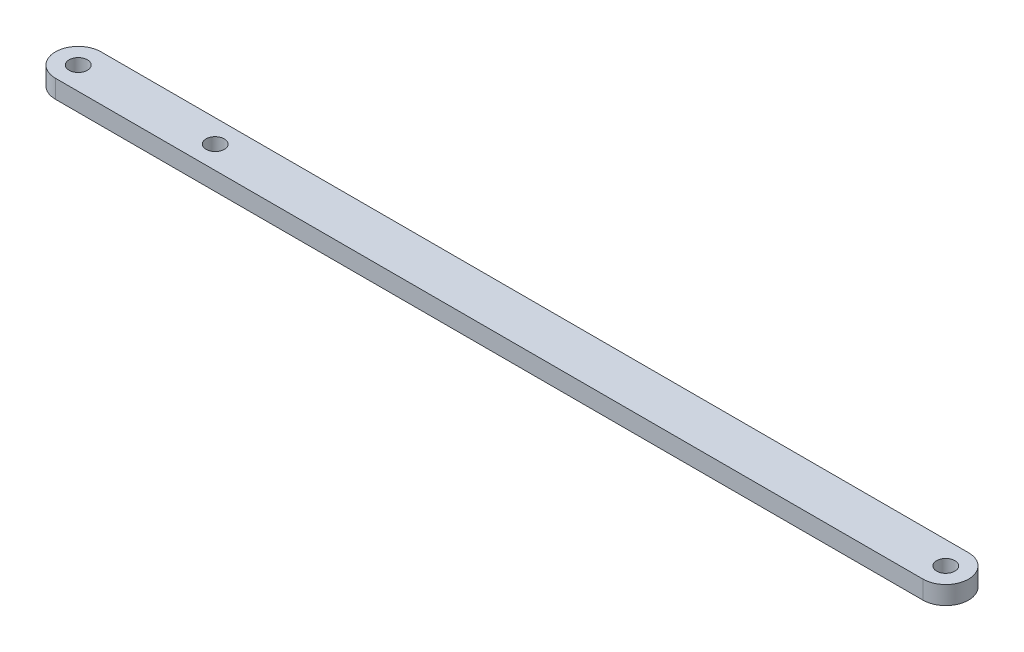
ISO-10303-21;
HEADER;
FILE_DESCRIPTION(('STEP AP214'),'2;1');
FILE_NAME('part.step','',(''),(''),'','','');
FILE_SCHEMA(('AUTOMOTIVE_DESIGN { 1 0 10303 214 1 1 1 1 }'));
ENDSEC;
DATA;
#1=APPLICATION_CONTEXT('core data for automotive mechanical design processes');
#2=APPLICATION_PROTOCOL_DEFINITION('international standard','automotive_design',2000,#1);
#3=PRODUCT_CONTEXT('',#1,'mechanical');
#4=PRODUCT('Part','Part','',(#3));
#5=PRODUCT_RELATED_PRODUCT_CATEGORY('part','',(#4));
#6=PRODUCT_DEFINITION_FORMATION('','',#4);
#7=PRODUCT_DEFINITION_CONTEXT('part definition',#1,'design');
#8=PRODUCT_DEFINITION('design','',#6,#7);
#9=PRODUCT_DEFINITION_SHAPE('','',#8);
#10=(LENGTH_UNIT() NAMED_UNIT(*) SI_UNIT(.MILLI.,.METRE.));
#11=(NAMED_UNIT(*) PLANE_ANGLE_UNIT() SI_UNIT($,.RADIAN.));
#12=(NAMED_UNIT(*) SI_UNIT($,.STERADIAN.) SOLID_ANGLE_UNIT());
#13=UNCERTAINTY_MEASURE_WITH_UNIT(LENGTH_MEASURE(1.E-05),#10,'distance_accuracy_value','');
#14=(GEOMETRIC_REPRESENTATION_CONTEXT(3) GLOBAL_UNCERTAINTY_ASSIGNED_CONTEXT((#13)) GLOBAL_UNIT_ASSIGNED_CONTEXT((#10,
#11,#12)) REPRESENTATION_CONTEXT('',''));
#15=CARTESIAN_POINT('',(0.,0.,0.));
#16=DIRECTION('',(0.,0.,1.));
#17=DIRECTION('',(1.,0.,0.));
#18=AXIS2_PLACEMENT_3D('',#15,#16,#17);
#19=CARTESIAN_POINT('',(-10.,2.,0.));
#20=DIRECTION('',(0.,1.,0.));
#21=DIRECTION('',(0.,0.,1.));
#22=AXIS2_PLACEMENT_3D('',#19,#20,#21);
#23=PLANE('',#22);
#24=CARTESIAN_POINT('',(-10.,2.,0.));
#25=DIRECTION('',(0.,1.,0.));
#26=DIRECTION('',(0.,0.,1.));
#27=AXIS2_PLACEMENT_3D('',#24,#25,#26);
#28=CIRCLE('',#27,1.);
#29=CARTESIAN_POINT('',(-10.,2.,1.));
#30=VERTEX_POINT('',#29);
#31=EDGE_CURVE('E119',#30,#30,#28,.T.);
#32=ORIENTED_EDGE('',*,*,#31,.F.);
#33=EDGE_LOOP('',(#32));
#34=FACE_BOUND('',#33,.T.);
#35=CARTESIAN_POINT('',(-10.,2.,0.));
#36=DIRECTION('',(0.,1.,0.));
#37=DIRECTION('',(0.,0.,1.));
#38=AXIS2_PLACEMENT_3D('',#35,#36,#37);
#39=CIRCLE('',#38,2.5);
#40=CARTESIAN_POINT('',(-10.,2.,-2.5));
#41=VERTEX_POINT('',#40);
#42=CARTESIAN_POINT('',(-10.,2.,2.5));
#43=VERTEX_POINT('',#42);
#44=EDGE_CURVE('E89',#41,#43,#39,.T.);
#45=ORIENTED_EDGE('',*,*,#44,.T.);
#46=DIRECTION('',(1.,0.,0.));
#47=VECTOR('',#46,1.);
#48=CARTESIAN_POINT('',(-10.,2.,2.5));
#49=LINE('',#48,#47);
#50=CARTESIAN_POINT('',(85.,2.,2.5));
#51=VERTEX_POINT('',#50);
#52=EDGE_CURVE('E84',#43,#51,#49,.T.);
#53=ORIENTED_EDGE('',*,*,#52,.T.);
#54=CARTESIAN_POINT('',(85.,2.,0.));
#55=DIRECTION('',(0.,1.,0.));
#56=DIRECTION('',(0.,0.,1.));
#57=AXIS2_PLACEMENT_3D('',#54,#55,#56);
#58=CIRCLE('',#57,2.5);
#59=CARTESIAN_POINT('',(85.,2.,-2.5));
#60=VERTEX_POINT('',#59);
#61=EDGE_CURVE('E87',#51,#60,#58,.T.);
#62=ORIENTED_EDGE('',*,*,#61,.T.);
#63=DIRECTION('',(-1.,0.,0.));
#64=VECTOR('',#63,1.);
#65=CARTESIAN_POINT('',(-10.,2.,-2.5));
#66=LINE('',#65,#64);
#67=EDGE_CURVE('E54',#60,#41,#66,.T.);
#68=ORIENTED_EDGE('',*,*,#67,.T.);
#69=EDGE_LOOP('',(#45,#53,#62,#68));
#70=FACE_BOUND('',#69,.T.);
#71=CARTESIAN_POINT('',(85.,2.,0.));
#72=DIRECTION('',(0.,1.,0.));
#73=DIRECTION('',(0.,0.,1.));
#74=AXIS2_PLACEMENT_3D('',#71,#72,#73);
#75=CIRCLE('',#74,0.999999999999998);
#76=CARTESIAN_POINT('',(85.,2.,0.999999999999998));
#77=VERTEX_POINT('',#76);
#78=EDGE_CURVE('E104',#77,#77,#75,.T.);
#79=ORIENTED_EDGE('',*,*,#78,.F.);
#80=EDGE_LOOP('',(#79));
#81=FACE_BOUND('',#80,.T.);
#82=CARTESIAN_POINT('',(5.,2.,0.));
#83=DIRECTION('',(0.,1.,0.));
#84=DIRECTION('',(0.,0.,1.));
#85=AXIS2_PLACEMENT_3D('',#82,#83,#84);
#86=CIRCLE('',#85,1.);
#87=CARTESIAN_POINT('',(5.,2.,1.));
#88=VERTEX_POINT('',#87);
#89=EDGE_CURVE('E125',#88,#88,#86,.T.);
#90=ORIENTED_EDGE('',*,*,#89,.F.);
#91=EDGE_LOOP('',(#90));
#92=FACE_BOUND('',#91,.T.);
#93=ADVANCED_FACE('F37',(#34,#70,#81,#92),#23,.T.);
#94=CARTESIAN_POINT('',(-10.,0.,0.));
#95=DIRECTION('',(0.,1.,0.));
#96=DIRECTION('',(0.,0.,1.));
#97=AXIS2_PLACEMENT_3D('',#94,#95,#96);
#98=PLANE('',#97);
#99=CARTESIAN_POINT('',(-10.,0.,0.));
#100=DIRECTION('',(0.,1.,0.));
#101=DIRECTION('',(0.,0.,1.));
#102=AXIS2_PLACEMENT_3D('',#99,#100,#101);
#103=CIRCLE('',#102,2.5);
#104=CARTESIAN_POINT('',(-10.,0.,-2.5));
#105=VERTEX_POINT('',#104);
#106=CARTESIAN_POINT('',(-10.,0.,2.5));
#107=VERTEX_POINT('',#106);
#108=EDGE_CURVE('E101',#105,#107,#103,.T.);
#109=ORIENTED_EDGE('',*,*,#108,.F.);
#110=DIRECTION('',(-1.,0.,0.));
#111=VECTOR('',#110,1.);
#112=CARTESIAN_POINT('',(-10.,0.,-2.5));
#113=LINE('',#112,#111);
#114=CARTESIAN_POINT('',(85.,0.,-2.5));
#115=VERTEX_POINT('',#114);
#116=EDGE_CURVE('E77',#115,#105,#113,.T.);
#117=ORIENTED_EDGE('',*,*,#116,.F.);
#118=CARTESIAN_POINT('',(85.,0.,0.));
#119=DIRECTION('',(0.,1.,0.));
#120=DIRECTION('',(0.,0.,1.));
#121=AXIS2_PLACEMENT_3D('',#118,#119,#120);
#122=CIRCLE('',#121,2.5);
#123=CARTESIAN_POINT('',(85.,0.,2.5));
#124=VERTEX_POINT('',#123);
#125=EDGE_CURVE('E71',#124,#115,#122,.T.);
#126=ORIENTED_EDGE('',*,*,#125,.F.);
#127=DIRECTION('',(1.,0.,0.));
#128=VECTOR('',#127,1.);
#129=CARTESIAN_POINT('',(-10.,0.,2.5));
#130=LINE('',#129,#128);
#131=EDGE_CURVE('E93',#107,#124,#130,.T.);
#132=ORIENTED_EDGE('',*,*,#131,.F.);
#133=EDGE_LOOP('',(#109,#117,#126,#132));
#134=FACE_BOUND('',#133,.T.);
#135=CARTESIAN_POINT('',(85.,0.,0.));
#136=DIRECTION('',(0.,1.,0.));
#137=DIRECTION('',(0.,0.,1.));
#138=AXIS2_PLACEMENT_3D('',#135,#136,#137);
#139=CIRCLE('',#138,0.999999999999998);
#140=CARTESIAN_POINT('',(85.,0.,0.999999999999998));
#141=VERTEX_POINT('',#140);
#142=EDGE_CURVE('E116',#141,#141,#139,.T.);
#143=ORIENTED_EDGE('',*,*,#142,.T.);
#144=EDGE_LOOP('',(#143));
#145=FACE_BOUND('',#144,.T.);
#146=CARTESIAN_POINT('',(-10.,0.,0.));
#147=DIRECTION('',(0.,1.,0.));
#148=DIRECTION('',(0.,0.,1.));
#149=AXIS2_PLACEMENT_3D('',#146,#147,#148);
#150=CIRCLE('',#149,1.);
#151=CARTESIAN_POINT('',(-10.,0.,1.));
#152=VERTEX_POINT('',#151);
#153=EDGE_CURVE('E122',#152,#152,#150,.T.);
#154=ORIENTED_EDGE('',*,*,#153,.T.);
#155=EDGE_LOOP('',(#154));
#156=FACE_BOUND('',#155,.T.);
#157=CARTESIAN_POINT('',(5.,0.,0.));
#158=DIRECTION('',(0.,1.,0.));
#159=DIRECTION('',(0.,0.,1.));
#160=AXIS2_PLACEMENT_3D('',#157,#158,#159);
#161=CIRCLE('',#160,1.);
#162=CARTESIAN_POINT('',(5.,0.,1.));
#163=VERTEX_POINT('',#162);
#164=EDGE_CURVE('E128',#163,#163,#161,.T.);
#165=ORIENTED_EDGE('',*,*,#164,.T.);
#166=EDGE_LOOP('',(#165));
#167=FACE_BOUND('',#166,.T.);
#168=ADVANCED_FACE('F112',(#134,#145,#156,#167),#98,.F.);
#169=CARTESIAN_POINT('',(-10.,2.,0.));
#170=DIRECTION('',(0.,-1.,0.));
#171=DIRECTION('',(0.,0.,-1.));
#172=AXIS2_PLACEMENT_3D('',#169,#170,#171);
#173=CYLINDRICAL_SURFACE('',#172,2.5);
#174=ORIENTED_EDGE('',*,*,#108,.T.);
#175=DIRECTION('',(0.,-1.,0.));
#176=VECTOR('',#175,1.);
#177=CARTESIAN_POINT('',(-10.,2.,2.5));
#178=LINE('',#177,#176);
#179=EDGE_CURVE('E11',#43,#107,#178,.T.);
#180=ORIENTED_EDGE('',*,*,#179,.F.);
#181=ORIENTED_EDGE('',*,*,#44,.F.);
#182=DIRECTION('',(0.,-1.,0.));
#183=VECTOR('',#182,1.);
#184=CARTESIAN_POINT('',(-10.,2.,-2.5));
#185=LINE('',#184,#183);
#186=EDGE_CURVE('E97',#41,#105,#185,.T.);
#187=ORIENTED_EDGE('',*,*,#186,.T.);
#188=EDGE_LOOP('',(#174,#180,#181,#187));
#189=FACE_BOUND('',#188,.T.);
#190=ADVANCED_FACE('F39',(#189),#173,.T.);
#191=CARTESIAN_POINT('',(-10.,2.,2.5));
#192=DIRECTION('',(0.,0.,-1.));
#193=DIRECTION('',(-1.,0.,0.));
#194=AXIS2_PLACEMENT_3D('',#191,#192,#193);
#195=PLANE('',#194);
#196=ORIENTED_EDGE('',*,*,#131,.T.);
#197=DIRECTION('',(0.,-1.,0.));
#198=VECTOR('',#197,1.);
#199=CARTESIAN_POINT('',(85.,2.,2.5));
#200=LINE('',#199,#198);
#201=EDGE_CURVE('E46',#51,#124,#200,.T.);
#202=ORIENTED_EDGE('',*,*,#201,.F.);
#203=ORIENTED_EDGE('',*,*,#52,.F.);
#204=ORIENTED_EDGE('',*,*,#179,.T.);
#205=EDGE_LOOP('',(#196,#202,#203,#204));
#206=FACE_BOUND('',#205,.T.);
#207=ADVANCED_FACE('F92',(#206),#195,.F.);
#208=CARTESIAN_POINT('',(85.,2.,0.));
#209=DIRECTION('',(0.,-1.,0.));
#210=DIRECTION('',(0.,0.,-1.));
#211=AXIS2_PLACEMENT_3D('',#208,#209,#210);
#212=CYLINDRICAL_SURFACE('',#211,2.5);
#213=ORIENTED_EDGE('',*,*,#125,.T.);
#214=DIRECTION('',(0.,-1.,0.));
#215=VECTOR('',#214,1.);
#216=CARTESIAN_POINT('',(85.,2.,-2.5));
#217=LINE('',#216,#215);
#218=EDGE_CURVE('E94',#60,#115,#217,.T.);
#219=ORIENTED_EDGE('',*,*,#218,.F.);
#220=ORIENTED_EDGE('',*,*,#61,.F.);
#221=ORIENTED_EDGE('',*,*,#201,.T.);
#222=EDGE_LOOP('',(#213,#219,#220,#221));
#223=FACE_BOUND('',#222,.T.);
#224=ADVANCED_FACE('F95',(#223),#212,.T.);
#225=CARTESIAN_POINT('',(-10.,2.,-2.5));
#226=DIRECTION('',(0.,0.,1.));
#227=DIRECTION('',(1.,0.,0.));
#228=AXIS2_PLACEMENT_3D('',#225,#226,#227);
#229=PLANE('',#228);
#230=ORIENTED_EDGE('',*,*,#116,.T.);
#231=ORIENTED_EDGE('',*,*,#186,.F.);
#232=ORIENTED_EDGE('',*,*,#67,.F.);
#233=ORIENTED_EDGE('',*,*,#218,.T.);
#234=EDGE_LOOP('',(#230,#231,#232,#233));
#235=FACE_BOUND('',#234,.T.);
#236=ADVANCED_FACE('F109',(#235),#229,.F.);
#237=CARTESIAN_POINT('',(85.,2.,0.));
#238=DIRECTION('',(0.,-1.,0.));
#239=DIRECTION('',(0.,0.,-1.));
#240=AXIS2_PLACEMENT_3D('',#237,#238,#239);
#241=CYLINDRICAL_SURFACE('',#240,0.999999999999998);
#242=ORIENTED_EDGE('',*,*,#78,.T.);
#243=EDGE_LOOP('',(#242));
#244=FACE_BOUND('',#243,.T.);
#245=ORIENTED_EDGE('',*,*,#142,.F.);
#246=EDGE_LOOP('',(#245));
#247=FACE_BOUND('',#246,.T.);
#248=ADVANCED_FACE('F146',(#244,#247),#241,.F.);
#249=CARTESIAN_POINT('',(-10.,2.,0.));
#250=DIRECTION('',(0.,-1.,0.));
#251=DIRECTION('',(0.,0.,-1.));
#252=AXIS2_PLACEMENT_3D('',#249,#250,#251);
#253=CYLINDRICAL_SURFACE('',#252,1.);
#254=ORIENTED_EDGE('',*,*,#31,.T.);
#255=EDGE_LOOP('',(#254));
#256=FACE_BOUND('',#255,.T.);
#257=ORIENTED_EDGE('',*,*,#153,.F.);
#258=EDGE_LOOP('',(#257));
#259=FACE_BOUND('',#258,.T.);
#260=ADVANCED_FACE('F200',(#256,#259),#253,.F.);
#261=CARTESIAN_POINT('',(5.,2.,0.));
#262=DIRECTION('',(0.,-1.,0.));
#263=DIRECTION('',(0.,0.,-1.));
#264=AXIS2_PLACEMENT_3D('',#261,#262,#263);
#265=CYLINDRICAL_SURFACE('',#264,1.);
#266=ORIENTED_EDGE('',*,*,#89,.T.);
#267=EDGE_LOOP('',(#266));
#268=FACE_BOUND('',#267,.T.);
#269=ORIENTED_EDGE('',*,*,#164,.F.);
#270=EDGE_LOOP('',(#269));
#271=FACE_BOUND('',#270,.T.);
#272=ADVANCED_FACE('F134',(#268,#271),#265,.F.);
#273=CLOSED_SHELL('',(#93,#168,#190,#207,#224,#236,#248,#260,#272));
#274=MANIFOLD_SOLID_BREP('B2',#273);
#275=ADVANCED_BREP_SHAPE_REPRESENTATION('',(#18,#274),#14);
#276=SHAPE_DEFINITION_REPRESENTATION(#9,#275);
ENDSEC;
END-ISO-10303-21;
